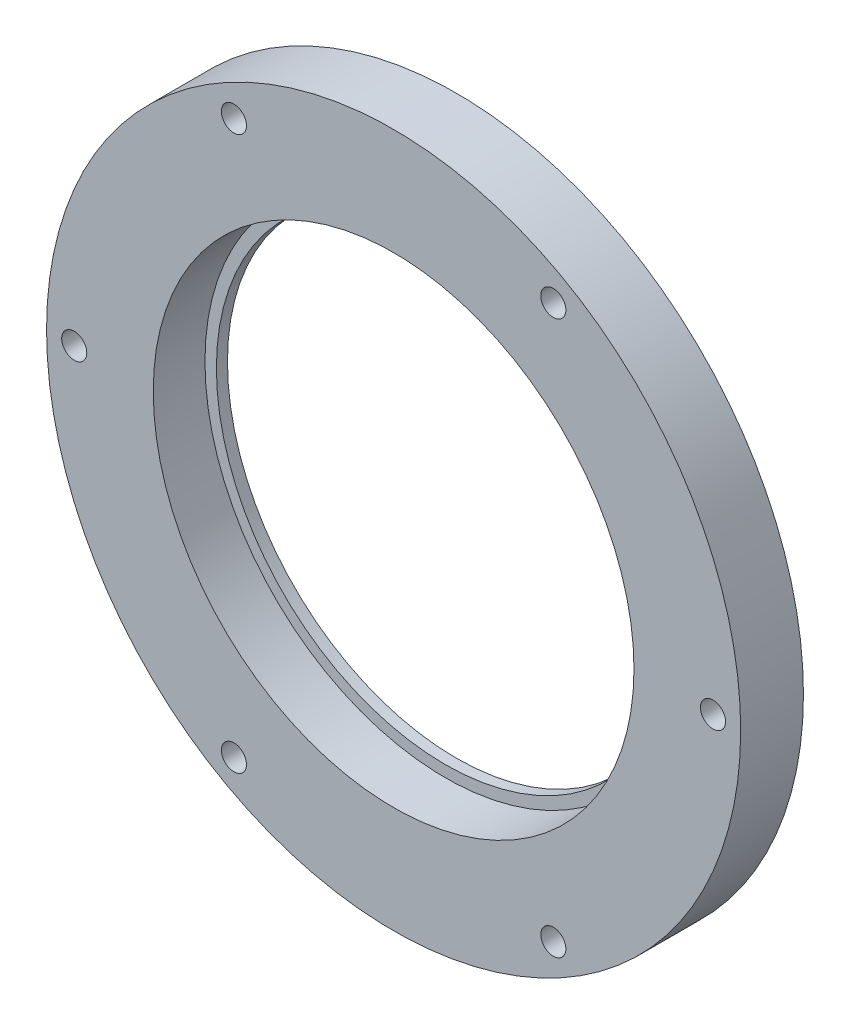
ISO-10303-21;
HEADER;
FILE_DESCRIPTION(('STEP AP214'),'2;1');
FILE_NAME('part.step','',(''),(''),'','','');
FILE_SCHEMA(('AUTOMOTIVE_DESIGN { 1 0 10303 214 1 1 1 1 }'));
ENDSEC;
DATA;
#1=APPLICATION_CONTEXT('core data for automotive mechanical design processes');
#2=APPLICATION_PROTOCOL_DEFINITION('international standard','automotive_design',2000,#1);
#3=PRODUCT_CONTEXT('',#1,'mechanical');
#4=PRODUCT('Part','Part','',(#3));
#5=PRODUCT_RELATED_PRODUCT_CATEGORY('part','',(#4));
#6=PRODUCT_DEFINITION_FORMATION('','',#4);
#7=PRODUCT_DEFINITION_CONTEXT('part definition',#1,'design');
#8=PRODUCT_DEFINITION('design','',#6,#7);
#9=PRODUCT_DEFINITION_SHAPE('','',#8);
#10=(LENGTH_UNIT() NAMED_UNIT(*) SI_UNIT(.MILLI.,.METRE.));
#11=(NAMED_UNIT(*) PLANE_ANGLE_UNIT() SI_UNIT($,.RADIAN.));
#12=(NAMED_UNIT(*) SI_UNIT($,.STERADIAN.) SOLID_ANGLE_UNIT());
#13=UNCERTAINTY_MEASURE_WITH_UNIT(LENGTH_MEASURE(1.E-05),#10,'distance_accuracy_value','');
#14=(GEOMETRIC_REPRESENTATION_CONTEXT(3) GLOBAL_UNCERTAINTY_ASSIGNED_CONTEXT((#13)) GLOBAL_UNIT_ASSIGNED_CONTEXT((#10,
#11,#12)) REPRESENTATION_CONTEXT('',''));
#15=CARTESIAN_POINT('',(0.,0.,0.));
#16=DIRECTION('',(0.,0.,1.));
#17=DIRECTION('',(1.,0.,0.));
#18=AXIS2_PLACEMENT_3D('',#15,#16,#17);
#19=CARTESIAN_POINT('',(0.,0.,8.5));
#20=DIRECTION('',(0.,0.,-1.));
#21=DIRECTION('',(-1.,0.,0.));
#22=AXIS2_PLACEMENT_3D('',#19,#20,#21);
#23=CYLINDRICAL_SURFACE('',#22,47.);
#24=CARTESIAN_POINT('',(0.,0.,8.5));
#25=DIRECTION('',(0.,0.,1.));
#26=DIRECTION('',(1.,0.,0.));
#27=AXIS2_PLACEMENT_3D('',#24,#25,#26);
#28=CIRCLE('',#27,47.);
#29=CARTESIAN_POINT('',(47.,0.,8.5));
#30=VERTEX_POINT('',#29);
#31=EDGE_CURVE('E10',#30,#30,#28,.T.);
#32=ORIENTED_EDGE('',*,*,#31,.F.);
#33=EDGE_LOOP('',(#32));
#34=FACE_BOUND('',#33,.T.);
#35=CARTESIAN_POINT('',(0.,0.,0.));
#36=DIRECTION('',(0.,0.,1.));
#37=DIRECTION('',(1.,0.,0.));
#38=AXIS2_PLACEMENT_3D('',#35,#36,#37);
#39=CIRCLE('',#38,47.);
#40=CARTESIAN_POINT('',(47.,0.,0.));
#41=VERTEX_POINT('',#40);
#42=EDGE_CURVE('E37',#41,#41,#39,.T.);
#43=ORIENTED_EDGE('',*,*,#42,.T.);
#44=EDGE_LOOP('',(#43));
#45=FACE_BOUND('',#44,.T.);
#46=ADVANCED_FACE('F40',(#34,#45),#23,.T.);
#47=CARTESIAN_POINT('',(0.,0.,8.5));
#48=DIRECTION('',(0.,0.,1.));
#49=DIRECTION('',(1.,0.,0.));
#50=AXIS2_PLACEMENT_3D('',#47,#48,#49);
#51=PLANE('',#50);
#52=CARTESIAN_POINT('',(-43.25,0.,8.5));
#53=DIRECTION('',(0.,0.,1.));
#54=DIRECTION('',(1.,0.,0.));
#55=AXIS2_PLACEMENT_3D('',#52,#53,#54);
#56=CIRCLE('',#55,1.7);
#57=CARTESIAN_POINT('',(-41.55,0.,8.5));
#58=VERTEX_POINT('',#57);
#59=EDGE_CURVE('E59',#58,#58,#56,.T.);
#60=ORIENTED_EDGE('',*,*,#59,.F.);
#61=EDGE_LOOP('',(#60));
#62=FACE_BOUND('',#61,.T.);
#63=CARTESIAN_POINT('',(-21.6250000000004,-37.4555987136767,8.5));
#64=DIRECTION('',(0.,0.,1.));
#65=DIRECTION('',(1.,0.,0.));
#66=AXIS2_PLACEMENT_3D('',#63,#64,#65);
#67=CIRCLE('',#66,1.69999999999999);
#68=CARTESIAN_POINT('',(-19.9250000000004,-37.4555987136767,8.5));
#69=VERTEX_POINT('',#68);
#70=EDGE_CURVE('E87',#69,#69,#67,.T.);
#71=ORIENTED_EDGE('',*,*,#70,.F.);
#72=EDGE_LOOP('',(#71));
#73=FACE_BOUND('',#72,.T.);
#74=CARTESIAN_POINT('',(21.6249999999996,-37.4555987136772,8.5));
#75=DIRECTION('',(0.,0.,1.));
#76=DIRECTION('',(1.,0.,0.));
#77=AXIS2_PLACEMENT_3D('',#74,#75,#76);
#78=CIRCLE('',#77,1.7);
#79=CARTESIAN_POINT('',(23.3249999999996,-37.4555987136772,8.5));
#80=VERTEX_POINT('',#79);
#81=EDGE_CURVE('E64',#80,#80,#78,.T.);
#82=ORIENTED_EDGE('',*,*,#81,.F.);
#83=EDGE_LOOP('',(#82));
#84=FACE_BOUND('',#83,.T.);
#85=CARTESIAN_POINT('',(43.25,-3.02013135809931E-13,8.5));
#86=DIRECTION('',(0.,0.,1.));
#87=DIRECTION('',(1.,0.,0.));
#88=AXIS2_PLACEMENT_3D('',#85,#86,#87);
#89=CIRCLE('',#88,1.7);
#90=CARTESIAN_POINT('',(44.95,-3.02013135809931E-13,8.5));
#91=VERTEX_POINT('',#90);
#92=EDGE_CURVE('E67',#91,#91,#89,.T.);
#93=ORIENTED_EDGE('',*,*,#92,.F.);
#94=EDGE_LOOP('',(#93));
#95=FACE_BOUND('',#94,.T.);
#96=CARTESIAN_POINT('',(21.6250000000002,37.4555987136769,8.5));
#97=DIRECTION('',(0.,0.,1.));
#98=DIRECTION('',(1.,0.,0.));
#99=AXIS2_PLACEMENT_3D('',#96,#97,#98);
#100=CIRCLE('',#99,1.7);
#101=CARTESIAN_POINT('',(23.3250000000002,37.4555987136769,8.5));
#102=VERTEX_POINT('',#101);
#103=EDGE_CURVE('E74',#102,#102,#100,.T.);
#104=ORIENTED_EDGE('',*,*,#103,.F.);
#105=EDGE_LOOP('',(#104));
#106=FACE_BOUND('',#105,.T.);
#107=CARTESIAN_POINT('',(-21.6249999999999,37.455598713677,8.5));
#108=DIRECTION('',(0.,0.,1.));
#109=DIRECTION('',(1.,0.,0.));
#110=AXIS2_PLACEMENT_3D('',#107,#108,#109);
#111=CIRCLE('',#110,1.7);
#112=CARTESIAN_POINT('',(-19.9249999999999,37.455598713677,8.5));
#113=VERTEX_POINT('',#112);
#114=EDGE_CURVE('E77',#113,#113,#111,.T.);
#115=ORIENTED_EDGE('',*,*,#114,.F.);
#116=EDGE_LOOP('',(#115));
#117=FACE_BOUND('',#116,.T.);
#118=CARTESIAN_POINT('',(0.,0.,8.5));
#119=DIRECTION('',(0.,0.,1.));
#120=DIRECTION('',(1.,0.,0.));
#121=AXIS2_PLACEMENT_3D('',#118,#119,#120);
#122=CIRCLE('',#121,32.55);
#123=CARTESIAN_POINT('',(32.55,0.,8.5));
#124=VERTEX_POINT('',#123);
#125=EDGE_CURVE('E47',#124,#124,#122,.T.);
#126=ORIENTED_EDGE('',*,*,#125,.F.);
#127=EDGE_LOOP('',(#126));
#128=FACE_BOUND('',#127,.T.);
#129=ORIENTED_EDGE('',*,*,#31,.T.);
#130=EDGE_LOOP('',(#129));
#131=FACE_BOUND('',#130,.T.);
#132=ADVANCED_FACE('F99',(#62,#73,#84,#95,#106,#117,#128,#131),#51,.T.);
#133=CARTESIAN_POINT('',(0.,0.,0.));
#134=DIRECTION('',(0.,0.,1.));
#135=DIRECTION('',(1.,0.,0.));
#136=AXIS2_PLACEMENT_3D('',#133,#134,#135);
#137=PLANE('',#136);
#138=CARTESIAN_POINT('',(-43.25,0.,0.));
#139=DIRECTION('',(0.,0.,1.));
#140=DIRECTION('',(1.,0.,0.));
#141=AXIS2_PLACEMENT_3D('',#138,#139,#140);
#142=CIRCLE('',#141,1.7);
#143=CARTESIAN_POINT('',(-41.55,0.,0.));
#144=VERTEX_POINT('',#143);
#145=EDGE_CURVE('E88',#144,#144,#142,.T.);
#146=ORIENTED_EDGE('',*,*,#145,.T.);
#147=EDGE_LOOP('',(#146));
#148=FACE_BOUND('',#147,.T.);
#149=CARTESIAN_POINT('',(-21.6250000000004,-37.4555987136767,0.));
#150=DIRECTION('',(0.,0.,1.));
#151=DIRECTION('',(1.,0.,0.));
#152=AXIS2_PLACEMENT_3D('',#149,#150,#151);
#153=CIRCLE('',#152,1.69999999999999);
#154=CARTESIAN_POINT('',(-19.9250000000004,-37.4555987136767,0.));
#155=VERTEX_POINT('',#154);
#156=EDGE_CURVE('E62',#155,#155,#153,.T.);
#157=ORIENTED_EDGE('',*,*,#156,.T.);
#158=EDGE_LOOP('',(#157));
#159=FACE_BOUND('',#158,.T.);
#160=CARTESIAN_POINT('',(21.6249999999996,-37.4555987136772,0.));
#161=DIRECTION('',(0.,0.,1.));
#162=DIRECTION('',(1.,0.,0.));
#163=AXIS2_PLACEMENT_3D('',#160,#161,#162);
#164=CIRCLE('',#163,1.7);
#165=CARTESIAN_POINT('',(23.3249999999996,-37.4555987136772,0.));
#166=VERTEX_POINT('',#165);
#167=EDGE_CURVE('E63',#166,#166,#164,.T.);
#168=ORIENTED_EDGE('',*,*,#167,.T.);
#169=EDGE_LOOP('',(#168));
#170=FACE_BOUND('',#169,.T.);
#171=CARTESIAN_POINT('',(43.25,-3.02013135809931E-13,0.));
#172=DIRECTION('',(0.,0.,1.));
#173=DIRECTION('',(1.,0.,0.));
#174=AXIS2_PLACEMENT_3D('',#171,#172,#173);
#175=CIRCLE('',#174,1.7);
#176=CARTESIAN_POINT('',(44.95,-3.02013135809931E-13,0.));
#177=VERTEX_POINT('',#176);
#178=EDGE_CURVE('E72',#177,#177,#175,.T.);
#179=ORIENTED_EDGE('',*,*,#178,.T.);
#180=EDGE_LOOP('',(#179));
#181=FACE_BOUND('',#180,.T.);
#182=CARTESIAN_POINT('',(21.6250000000002,37.4555987136769,0.));
#183=DIRECTION('',(0.,0.,1.));
#184=DIRECTION('',(1.,0.,0.));
#185=AXIS2_PLACEMENT_3D('',#182,#183,#184);
#186=CIRCLE('',#185,1.7);
#187=CARTESIAN_POINT('',(23.3250000000002,37.4555987136769,0.));
#188=VERTEX_POINT('',#187);
#189=EDGE_CURVE('E76',#188,#188,#186,.T.);
#190=ORIENTED_EDGE('',*,*,#189,.T.);
#191=EDGE_LOOP('',(#190));
#192=FACE_BOUND('',#191,.T.);
#193=CARTESIAN_POINT('',(-21.6249999999999,37.455598713677,0.));
#194=DIRECTION('',(0.,0.,1.));
#195=DIRECTION('',(1.,0.,0.));
#196=AXIS2_PLACEMENT_3D('',#193,#194,#195);
#197=CIRCLE('',#196,1.7);
#198=CARTESIAN_POINT('',(-19.9249999999999,37.455598713677,0.));
#199=VERTEX_POINT('',#198);
#200=EDGE_CURVE('E82',#199,#199,#197,.T.);
#201=ORIENTED_EDGE('',*,*,#200,.T.);
#202=EDGE_LOOP('',(#201));
#203=FACE_BOUND('',#202,.T.);
#204=CARTESIAN_POINT('',(0.,0.,0.));
#205=DIRECTION('',(0.,0.,1.));
#206=DIRECTION('',(1.,0.,0.));
#207=AXIS2_PLACEMENT_3D('',#204,#205,#206);
#208=CIRCLE('',#207,31.);
#209=CARTESIAN_POINT('',(31.,0.,0.));
#210=VERTEX_POINT('',#209);
#211=EDGE_CURVE('E55',#210,#210,#208,.T.);
#212=ORIENTED_EDGE('',*,*,#211,.T.);
#213=EDGE_LOOP('',(#212));
#214=FACE_BOUND('',#213,.T.);
#215=ORIENTED_EDGE('',*,*,#42,.F.);
#216=EDGE_LOOP('',(#215));
#217=FACE_BOUND('',#216,.T.);
#218=ADVANCED_FACE('F103',(#148,#159,#170,#181,#192,#203,#214,#217),#137,.F.);
#219=CARTESIAN_POINT('',(0.,0.,1.5));
#220=DIRECTION('',(0.,0.,1.));
#221=DIRECTION('',(1.,0.,0.));
#222=AXIS2_PLACEMENT_3D('',#219,#220,#221);
#223=CYLINDRICAL_SURFACE('',#222,32.55);
#224=CARTESIAN_POINT('',(0.,0.,1.5));
#225=DIRECTION('',(0.,0.,1.));
#226=DIRECTION('',(1.,0.,0.));
#227=AXIS2_PLACEMENT_3D('',#224,#225,#226);
#228=CIRCLE('',#227,32.55);
#229=CARTESIAN_POINT('',(32.55,0.,1.5));
#230=VERTEX_POINT('',#229);
#231=EDGE_CURVE('E50',#230,#230,#228,.T.);
#232=ORIENTED_EDGE('',*,*,#231,.F.);
#233=EDGE_LOOP('',(#232));
#234=FACE_BOUND('',#233,.T.);
#235=ORIENTED_EDGE('',*,*,#125,.T.);
#236=EDGE_LOOP('',(#235));
#237=FACE_BOUND('',#236,.T.);
#238=ADVANCED_FACE('F116',(#234,#237),#223,.F.);
#239=CARTESIAN_POINT('',(0.,0.,1.5));
#240=DIRECTION('',(0.,0.,1.));
#241=DIRECTION('',(1.,0.,0.));
#242=AXIS2_PLACEMENT_3D('',#239,#240,#241);
#243=PLANE('',#242);
#244=CARTESIAN_POINT('',(0.,0.,1.5));
#245=DIRECTION('',(0.,0.,1.));
#246=DIRECTION('',(1.,0.,0.));
#247=AXIS2_PLACEMENT_3D('',#244,#245,#246);
#248=CIRCLE('',#247,31.);
#249=CARTESIAN_POINT('',(31.,0.,1.5));
#250=VERTEX_POINT('',#249);
#251=EDGE_CURVE('E54',#250,#250,#248,.T.);
#252=ORIENTED_EDGE('',*,*,#251,.F.);
#253=EDGE_LOOP('',(#252));
#254=FACE_BOUND('',#253,.T.);
#255=ORIENTED_EDGE('',*,*,#231,.T.);
#256=EDGE_LOOP('',(#255));
#257=FACE_BOUND('',#256,.T.);
#258=ADVANCED_FACE('F118',(#254,#257),#243,.T.);
#259=CARTESIAN_POINT('',(0.,0.,0.));
#260=DIRECTION('',(0.,0.,1.));
#261=DIRECTION('',(1.,0.,0.));
#262=AXIS2_PLACEMENT_3D('',#259,#260,#261);
#263=CYLINDRICAL_SURFACE('',#262,31.);
#264=ORIENTED_EDGE('',*,*,#211,.F.);
#265=EDGE_LOOP('',(#264));
#266=FACE_BOUND('',#265,.T.);
#267=ORIENTED_EDGE('',*,*,#251,.T.);
#268=EDGE_LOOP('',(#267));
#269=FACE_BOUND('',#268,.T.);
#270=ADVANCED_FACE('F127',(#266,#269),#263,.F.);
#271=CARTESIAN_POINT('',(-21.6249999999999,37.455598713677,8.5));
#272=DIRECTION('',(0.,0.,-1.));
#273=DIRECTION('',(-1.,0.,0.));
#274=AXIS2_PLACEMENT_3D('',#271,#272,#273);
#275=CYLINDRICAL_SURFACE('',#274,1.7);
#276=ORIENTED_EDGE('',*,*,#114,.T.);
#277=EDGE_LOOP('',(#276));
#278=FACE_BOUND('',#277,.T.);
#279=ORIENTED_EDGE('',*,*,#200,.F.);
#280=EDGE_LOOP('',(#279));
#281=FACE_BOUND('',#280,.T.);
#282=ADVANCED_FACE('F174',(#278,#281),#275,.F.);
#283=CARTESIAN_POINT('',(21.6250000000002,37.4555987136769,8.5));
#284=DIRECTION('',(0.,0.,-1.));
#285=DIRECTION('',(-1.,0.,0.));
#286=AXIS2_PLACEMENT_3D('',#283,#284,#285);
#287=CYLINDRICAL_SURFACE('',#286,1.7);
#288=ORIENTED_EDGE('',*,*,#103,.T.);
#289=EDGE_LOOP('',(#288));
#290=FACE_BOUND('',#289,.T.);
#291=ORIENTED_EDGE('',*,*,#189,.F.);
#292=EDGE_LOOP('',(#291));
#293=FACE_BOUND('',#292,.T.);
#294=ADVANCED_FACE('F176',(#290,#293),#287,.F.);
#295=CARTESIAN_POINT('',(43.25,-3.02013135809931E-13,8.5));
#296=DIRECTION('',(0.,0.,-1.));
#297=DIRECTION('',(-1.,0.,0.));
#298=AXIS2_PLACEMENT_3D('',#295,#296,#297);
#299=CYLINDRICAL_SURFACE('',#298,1.7);
#300=ORIENTED_EDGE('',*,*,#92,.T.);
#301=EDGE_LOOP('',(#300));
#302=FACE_BOUND('',#301,.T.);
#303=ORIENTED_EDGE('',*,*,#178,.F.);
#304=EDGE_LOOP('',(#303));
#305=FACE_BOUND('',#304,.T.);
#306=ADVANCED_FACE('F187',(#302,#305),#299,.F.);
#307=CARTESIAN_POINT('',(21.6249999999996,-37.4555987136772,8.5));
#308=DIRECTION('',(0.,0.,-1.));
#309=DIRECTION('',(-1.,0.,0.));
#310=AXIS2_PLACEMENT_3D('',#307,#308,#309);
#311=CYLINDRICAL_SURFACE('',#310,1.7);
#312=ORIENTED_EDGE('',*,*,#81,.T.);
#313=EDGE_LOOP('',(#312));
#314=FACE_BOUND('',#313,.T.);
#315=ORIENTED_EDGE('',*,*,#167,.F.);
#316=EDGE_LOOP('',(#315));
#317=FACE_BOUND('',#316,.T.);
#318=ADVANCED_FACE('F199',(#314,#317),#311,.F.);
#319=CARTESIAN_POINT('',(-21.6250000000004,-37.4555987136767,8.5));
#320=DIRECTION('',(0.,0.,-1.));
#321=DIRECTION('',(-1.,0.,0.));
#322=AXIS2_PLACEMENT_3D('',#319,#320,#321);
#323=CYLINDRICAL_SURFACE('',#322,1.69999999999999);
#324=ORIENTED_EDGE('',*,*,#70,.T.);
#325=EDGE_LOOP('',(#324));
#326=FACE_BOUND('',#325,.T.);
#327=ORIENTED_EDGE('',*,*,#156,.F.);
#328=EDGE_LOOP('',(#327));
#329=FACE_BOUND('',#328,.T.);
#330=ADVANCED_FACE('F209',(#326,#329),#323,.F.);
#331=CARTESIAN_POINT('',(-43.25,0.,8.5));
#332=DIRECTION('',(0.,0.,-1.));
#333=DIRECTION('',(-1.,0.,0.));
#334=AXIS2_PLACEMENT_3D('',#331,#332,#333);
#335=CYLINDRICAL_SURFACE('',#334,1.7);
#336=ORIENTED_EDGE('',*,*,#59,.T.);
#337=EDGE_LOOP('',(#336));
#338=FACE_BOUND('',#337,.T.);
#339=ORIENTED_EDGE('',*,*,#145,.F.);
#340=EDGE_LOOP('',(#339));
#341=FACE_BOUND('',#340,.T.);
#342=ADVANCED_FACE('F100',(#338,#341),#335,.F.);
#343=CLOSED_SHELL('',(#46,#132,#218,#238,#258,#270,#282,#294,#306,#318,#330,#342));
#344=MANIFOLD_SOLID_BREP('B2',#343);
#345=ADVANCED_BREP_SHAPE_REPRESENTATION('',(#18,#344),#14);
#346=SHAPE_DEFINITION_REPRESENTATION(#9,#345);
ENDSEC;
END-ISO-10303-21;
